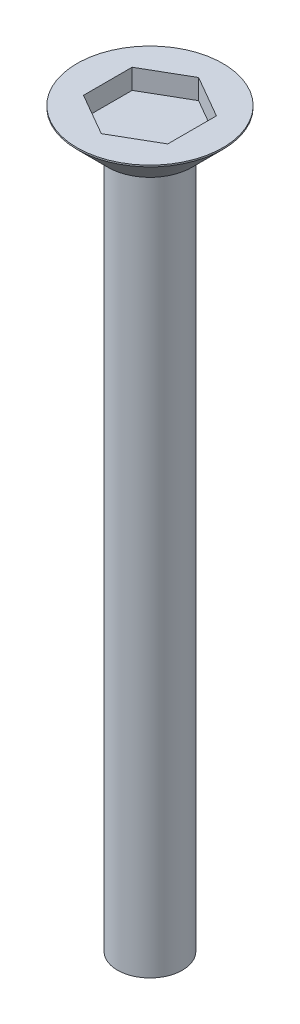
ISO-10303-21;
HEADER;
FILE_DESCRIPTION(('STEP AP214'),'2;1');
FILE_NAME('part.step','',(''),(''),'','','');
FILE_SCHEMA(('AUTOMOTIVE_DESIGN { 1 0 10303 214 1 1 1 1 }'));
ENDSEC;
DATA;
#1=APPLICATION_CONTEXT('core data for automotive mechanical design processes');
#2=APPLICATION_PROTOCOL_DEFINITION('international standard','automotive_design',2000,#1);
#3=PRODUCT_CONTEXT('',#1,'mechanical');
#4=PRODUCT('Part','Part','',(#3));
#5=PRODUCT_RELATED_PRODUCT_CATEGORY('part','',(#4));
#6=PRODUCT_DEFINITION_FORMATION('','',#4);
#7=PRODUCT_DEFINITION_CONTEXT('part definition',#1,'design');
#8=PRODUCT_DEFINITION('design','',#6,#7);
#9=PRODUCT_DEFINITION_SHAPE('','',#8);
#10=(LENGTH_UNIT() NAMED_UNIT(*) SI_UNIT(.MILLI.,.METRE.));
#11=(NAMED_UNIT(*) PLANE_ANGLE_UNIT() SI_UNIT($,.RADIAN.));
#12=(NAMED_UNIT(*) SI_UNIT($,.STERADIAN.) SOLID_ANGLE_UNIT());
#13=UNCERTAINTY_MEASURE_WITH_UNIT(LENGTH_MEASURE(1.E-05),#10,'distance_accuracy_value','');
#14=(GEOMETRIC_REPRESENTATION_CONTEXT(3) GLOBAL_UNCERTAINTY_ASSIGNED_CONTEXT((#13)) GLOBAL_UNIT_ASSIGNED_CONTEXT((#10,
#11,#12)) REPRESENTATION_CONTEXT('',''));
#15=CARTESIAN_POINT('',(0.,0.,0.));
#16=DIRECTION('',(0.,0.,1.));
#17=DIRECTION('',(1.,0.,0.));
#18=AXIS2_PLACEMENT_3D('',#15,#16,#17);
#19=CARTESIAN_POINT('',(0.,43.18,0.));
#20=DIRECTION('',(0.,-1.,0.));
#21=DIRECTION('',(0.,0.,-1.));
#22=AXIS2_PLACEMENT_3D('',#19,#20,#21);
#23=CYLINDRICAL_SURFACE('',#22,2.);
#24=CARTESIAN_POINT('',(0.,43.18,0.));
#25=DIRECTION('',(0.,1.,0.));
#26=DIRECTION('',(0.,0.,1.));
#27=AXIS2_PLACEMENT_3D('',#24,#25,#26);
#28=CIRCLE('',#27,2.);
#29=CARTESIAN_POINT('',(0.,43.18,2.));
#30=VERTEX_POINT('',#29);
#31=EDGE_CURVE('E153',#30,#30,#28,.T.);
#32=ORIENTED_EDGE('',*,*,#31,.F.);
#33=EDGE_LOOP('',(#32));
#34=FACE_BOUND('',#33,.T.);
#35=CARTESIAN_POINT('',(0.,0.,0.));
#36=DIRECTION('',(0.,1.,0.));
#37=DIRECTION('',(0.,0.,1.));
#38=AXIS2_PLACEMENT_3D('',#35,#36,#37);
#39=CIRCLE('',#38,2.);
#40=CARTESIAN_POINT('',(0.,0.,2.));
#41=VERTEX_POINT('',#40);
#42=EDGE_CURVE('E152',#41,#41,#39,.T.);
#43=ORIENTED_EDGE('',*,*,#42,.T.);
#44=EDGE_LOOP('',(#43));
#45=FACE_BOUND('',#44,.T.);
#46=ADVANCED_FACE('F41',(#34,#45),#23,.T.);
#47=CARTESIAN_POINT('',(0.,0.,0.));
#48=DIRECTION('',(0.,1.,0.));
#49=DIRECTION('',(0.,0.,1.));
#50=AXIS2_PLACEMENT_3D('',#47,#48,#49);
#51=PLANE('',#50);
#52=ORIENTED_EDGE('',*,*,#42,.F.);
#53=EDGE_LOOP('',(#52));
#54=FACE_BOUND('',#53,.T.);
#55=ADVANCED_FACE('F173',(#54),#51,.F.);
#56=CARTESIAN_POINT('',(0.,45.18,0.));
#57=DIRECTION('',(0.,-1.,0.));
#58=DIRECTION('',(0.,0.,-1.));
#59=AXIS2_PLACEMENT_3D('',#56,#57,#58);
#60=CYLINDRICAL_SURFACE('',#59,4.5);
#61=CARTESIAN_POINT('',(0.,45.085,0.));
#62=DIRECTION('',(0.,1.,0.));
#63=DIRECTION('',(0.,0.,1.));
#64=AXIS2_PLACEMENT_3D('',#61,#62,#63);
#65=CIRCLE('',#64,4.5);
#66=CARTESIAN_POINT('',(0.,45.085,4.5));
#67=VERTEX_POINT('',#66);
#68=EDGE_CURVE('E50',#67,#67,#65,.T.);
#69=ORIENTED_EDGE('',*,*,#68,.T.);
#70=EDGE_LOOP('',(#69));
#71=FACE_BOUND('',#70,.T.);
#72=CARTESIAN_POINT('',(0.,45.18,0.));
#73=DIRECTION('',(0.,1.,0.));
#74=DIRECTION('',(0.,0.,1.));
#75=AXIS2_PLACEMENT_3D('',#72,#73,#74);
#76=CIRCLE('',#75,4.5);
#77=CARTESIAN_POINT('',(0.,45.18,4.5));
#78=VERTEX_POINT('',#77);
#79=EDGE_CURVE('E144',#78,#78,#76,.T.);
#80=ORIENTED_EDGE('',*,*,#79,.F.);
#81=EDGE_LOOP('',(#80));
#82=FACE_BOUND('',#81,.T.);
#83=ADVANCED_FACE('F160',(#71,#82),#60,.T.);
#84=CARTESIAN_POINT('',(0.,45.18,0.));
#85=DIRECTION('',(0.,1.,0.));
#86=DIRECTION('',(0.,0.,1.));
#87=AXIS2_PLACEMENT_3D('',#84,#85,#86);
#88=PLANE('',#87);
#89=DIRECTION('',(-0.866025403784439,0.,-0.5));
#90=VECTOR('',#89,1.);
#91=CARTESIAN_POINT('',(2.59807621135332,45.18,-1.5));
#92=LINE('',#91,#90);
#93=CARTESIAN_POINT('',(2.59807621135332,45.18,-1.5));
#94=VERTEX_POINT('',#93);
#95=CARTESIAN_POINT('',(0.,45.18,-3.));
#96=VERTEX_POINT('',#95);
#97=EDGE_CURVE('E57',#94,#96,#92,.T.);
#98=ORIENTED_EDGE('',*,*,#97,.F.);
#99=DIRECTION('',(0.,0.,-1.));
#100=VECTOR('',#99,1.);
#101=CARTESIAN_POINT('',(2.59807621135332,45.18,1.5));
#102=LINE('',#101,#100);
#103=CARTESIAN_POINT('',(2.59807621135332,45.18,1.5));
#104=VERTEX_POINT('',#103);
#105=EDGE_CURVE('E140',#104,#94,#102,.T.);
#106=ORIENTED_EDGE('',*,*,#105,.F.);
#107=DIRECTION('',(0.866025403784439,0.,-0.5));
#108=VECTOR('',#107,1.);
#109=CARTESIAN_POINT('',(0.,45.18,3.));
#110=LINE('',#109,#108);
#111=CARTESIAN_POINT('',(0.,45.18,3.));
#112=VERTEX_POINT('',#111);
#113=EDGE_CURVE('E138',#112,#104,#110,.T.);
#114=ORIENTED_EDGE('',*,*,#113,.F.);
#115=DIRECTION('',(0.866025403784439,0.,0.5));
#116=VECTOR('',#115,1.);
#117=CARTESIAN_POINT('',(-2.59807621135332,45.18,1.5));
#118=LINE('',#117,#116);
#119=CARTESIAN_POINT('',(-2.59807621135332,45.18,1.5));
#120=VERTEX_POINT('',#119);
#121=EDGE_CURVE('E105',#120,#112,#118,.T.);
#122=ORIENTED_EDGE('',*,*,#121,.F.);
#123=DIRECTION('',(0.,0.,1.));
#124=VECTOR('',#123,1.);
#125=CARTESIAN_POINT('',(-2.59807621135332,45.18,-1.5));
#126=LINE('',#125,#124);
#127=CARTESIAN_POINT('',(-2.59807621135332,45.18,-1.5));
#128=VERTEX_POINT('',#127);
#129=EDGE_CURVE('E134',#128,#120,#126,.T.);
#130=ORIENTED_EDGE('',*,*,#129,.F.);
#131=DIRECTION('',(-0.866025403784439,0.,0.5));
#132=VECTOR('',#131,1.);
#133=CARTESIAN_POINT('',(0.,45.18,-3.));
#134=LINE('',#133,#132);
#135=EDGE_CURVE('E131',#96,#128,#134,.T.);
#136=ORIENTED_EDGE('',*,*,#135,.F.);
#137=EDGE_LOOP('',(#98,#106,#114,#122,#130,#136));
#138=FACE_BOUND('',#137,.T.);
#139=ORIENTED_EDGE('',*,*,#79,.T.);
#140=EDGE_LOOP('',(#139));
#141=FACE_BOUND('',#140,.T.);
#142=ADVANCED_FACE('F185',(#138,#141),#88,.T.);
#143=CARTESIAN_POINT('',(0.,43.18,0.));
#144=DIRECTION('',(0.,1.,0.));
#145=DIRECTION('',(0.,0.,1.));
#146=AXIS2_PLACEMENT_3D('',#143,#144,#145);
#147=PLANE('',#146);
#148=CARTESIAN_POINT('',(0.,43.18,0.));
#149=DIRECTION('',(0.,1.,0.));
#150=DIRECTION('',(0.,0.,1.));
#151=AXIS2_PLACEMENT_3D('',#148,#149,#150);
#152=CIRCLE('',#151,2.595);
#153=CARTESIAN_POINT('',(0.,43.18,2.595));
#154=VERTEX_POINT('',#153);
#155=EDGE_CURVE('E11',#154,#154,#152,.F.);
#156=ORIENTED_EDGE('',*,*,#155,.T.);
#157=EDGE_LOOP('',(#156));
#158=FACE_BOUND('',#157,.T.);
#159=ORIENTED_EDGE('',*,*,#31,.T.);
#160=EDGE_LOOP('',(#159));
#161=FACE_BOUND('',#160,.T.);
#162=ADVANCED_FACE('F186',(#158,#161),#147,.F.);
#163=CARTESIAN_POINT('',(2.59807621135332,43.942,-1.5));
#164=DIRECTION('',(0.5,0.,-0.866025403784439));
#165=DIRECTION('',(-0.866025403784439,0.,-0.5));
#166=AXIS2_PLACEMENT_3D('',#163,#164,#165);
#167=PLANE('',#166);
#168=ORIENTED_EDGE('',*,*,#97,.T.);
#169=DIRECTION('',(0.,1.,0.));
#170=VECTOR('',#169,1.);
#171=CARTESIAN_POINT('',(0.,43.942,-3.));
#172=LINE('',#171,#170);
#173=CARTESIAN_POINT('',(0.,43.942,-3.));
#174=VERTEX_POINT('',#173);
#175=EDGE_CURVE('E87',#174,#96,#172,.T.);
#176=ORIENTED_EDGE('',*,*,#175,.F.);
#177=DIRECTION('',(-0.866025403784439,0.,-0.5));
#178=VECTOR('',#177,1.);
#179=CARTESIAN_POINT('',(2.59807621135332,43.942,-1.5));
#180=LINE('',#179,#178);
#181=CARTESIAN_POINT('',(2.59807621135332,43.942,-1.5));
#182=VERTEX_POINT('',#181);
#183=EDGE_CURVE('E142',#182,#174,#180,.T.);
#184=ORIENTED_EDGE('',*,*,#183,.F.);
#185=DIRECTION('',(0.,1.,0.));
#186=VECTOR('',#185,1.);
#187=CARTESIAN_POINT('',(2.59807621135332,43.942,-1.5));
#188=LINE('',#187,#186);
#189=EDGE_CURVE('E65',#182,#94,#188,.T.);
#190=ORIENTED_EDGE('',*,*,#189,.T.);
#191=EDGE_LOOP('',(#168,#176,#184,#190));
#192=FACE_BOUND('',#191,.T.);
#193=ADVANCED_FACE('F188',(#192),#167,.F.);
#194=CARTESIAN_POINT('',(2.59807621135332,43.942,1.5));
#195=DIRECTION('',(1.,0.,0.));
#196=DIRECTION('',(0.,0.,-1.));
#197=AXIS2_PLACEMENT_3D('',#194,#195,#196);
#198=PLANE('',#197);
#199=ORIENTED_EDGE('',*,*,#105,.T.);
#200=ORIENTED_EDGE('',*,*,#189,.F.);
#201=DIRECTION('',(0.,0.,-1.));
#202=VECTOR('',#201,1.);
#203=CARTESIAN_POINT('',(2.59807621135332,43.942,1.5));
#204=LINE('',#203,#202);
#205=CARTESIAN_POINT('',(2.59807621135332,43.942,1.5));
#206=VERTEX_POINT('',#205);
#207=EDGE_CURVE('E117',#206,#182,#204,.T.);
#208=ORIENTED_EDGE('',*,*,#207,.F.);
#209=DIRECTION('',(0.,1.,0.));
#210=VECTOR('',#209,1.);
#211=CARTESIAN_POINT('',(2.59807621135332,43.942,1.5));
#212=LINE('',#211,#210);
#213=EDGE_CURVE('E109',#206,#104,#212,.T.);
#214=ORIENTED_EDGE('',*,*,#213,.T.);
#215=EDGE_LOOP('',(#199,#200,#208,#214));
#216=FACE_BOUND('',#215,.T.);
#217=ADVANCED_FACE('F195',(#216),#198,.F.);
#218=CARTESIAN_POINT('',(0.,43.942,3.));
#219=DIRECTION('',(0.5,0.,0.866025403784439));
#220=DIRECTION('',(0.866025403784439,0.,-0.5));
#221=AXIS2_PLACEMENT_3D('',#218,#219,#220);
#222=PLANE('',#221);
#223=ORIENTED_EDGE('',*,*,#113,.T.);
#224=ORIENTED_EDGE('',*,*,#213,.F.);
#225=DIRECTION('',(0.866025403784439,0.,-0.5));
#226=VECTOR('',#225,1.);
#227=CARTESIAN_POINT('',(0.,43.942,3.));
#228=LINE('',#227,#226);
#229=CARTESIAN_POINT('',(0.,43.942,3.));
#230=VERTEX_POINT('',#229);
#231=EDGE_CURVE('E113',#230,#206,#228,.T.);
#232=ORIENTED_EDGE('',*,*,#231,.F.);
#233=DIRECTION('',(0.,1.,0.));
#234=VECTOR('',#233,1.);
#235=CARTESIAN_POINT('',(0.,43.942,3.));
#236=LINE('',#235,#234);
#237=EDGE_CURVE('E98',#230,#112,#236,.T.);
#238=ORIENTED_EDGE('',*,*,#237,.T.);
#239=EDGE_LOOP('',(#223,#224,#232,#238));
#240=FACE_BOUND('',#239,.T.);
#241=ADVANCED_FACE('F114',(#240),#222,.F.);
#242=CARTESIAN_POINT('',(-2.59807621135332,43.942,1.5));
#243=DIRECTION('',(-0.5,0.,0.866025403784439));
#244=DIRECTION('',(0.866025403784439,0.,0.5));
#245=AXIS2_PLACEMENT_3D('',#242,#243,#244);
#246=PLANE('',#245);
#247=ORIENTED_EDGE('',*,*,#121,.T.);
#248=ORIENTED_EDGE('',*,*,#237,.F.);
#249=DIRECTION('',(0.866025403784439,0.,0.5));
#250=VECTOR('',#249,1.);
#251=CARTESIAN_POINT('',(-2.59807621135332,43.942,1.5));
#252=LINE('',#251,#250);
#253=CARTESIAN_POINT('',(-2.59807621135332,43.942,1.5));
#254=VERTEX_POINT('',#253);
#255=EDGE_CURVE('E102',#254,#230,#252,.T.);
#256=ORIENTED_EDGE('',*,*,#255,.F.);
#257=DIRECTION('',(0.,1.,0.));
#258=VECTOR('',#257,1.);
#259=CARTESIAN_POINT('',(-2.59807621135332,43.942,1.5));
#260=LINE('',#259,#258);
#261=EDGE_CURVE('E110',#254,#120,#260,.T.);
#262=ORIENTED_EDGE('',*,*,#261,.T.);
#263=EDGE_LOOP('',(#247,#248,#256,#262));
#264=FACE_BOUND('',#263,.T.);
#265=ADVANCED_FACE('F100',(#264),#246,.F.);
#266=CARTESIAN_POINT('',(-2.59807621135332,43.942,-1.5));
#267=DIRECTION('',(-1.,0.,0.));
#268=DIRECTION('',(0.,0.,1.));
#269=AXIS2_PLACEMENT_3D('',#266,#267,#268);
#270=PLANE('',#269);
#271=ORIENTED_EDGE('',*,*,#129,.T.);
#272=ORIENTED_EDGE('',*,*,#261,.F.);
#273=DIRECTION('',(0.,0.,1.));
#274=VECTOR('',#273,1.);
#275=CARTESIAN_POINT('',(-2.59807621135332,43.942,-1.5));
#276=LINE('',#275,#274);
#277=CARTESIAN_POINT('',(-2.59807621135332,43.942,-1.5));
#278=VERTEX_POINT('',#277);
#279=EDGE_CURVE('E123',#278,#254,#276,.T.);
#280=ORIENTED_EDGE('',*,*,#279,.F.);
#281=DIRECTION('',(0.,1.,0.));
#282=VECTOR('',#281,1.);
#283=CARTESIAN_POINT('',(-2.59807621135332,43.942,-1.5));
#284=LINE('',#283,#282);
#285=EDGE_CURVE('E147',#278,#128,#284,.T.);
#286=ORIENTED_EDGE('',*,*,#285,.T.);
#287=EDGE_LOOP('',(#271,#272,#280,#286));
#288=FACE_BOUND('',#287,.T.);
#289=ADVANCED_FACE('F198',(#288),#270,.F.);
#290=CARTESIAN_POINT('',(0.,43.942,-3.));
#291=DIRECTION('',(-0.5,0.,-0.866025403784439));
#292=DIRECTION('',(-0.866025403784439,0.,0.5));
#293=AXIS2_PLACEMENT_3D('',#290,#291,#292);
#294=PLANE('',#293);
#295=ORIENTED_EDGE('',*,*,#135,.T.);
#296=ORIENTED_EDGE('',*,*,#285,.F.);
#297=DIRECTION('',(-0.866025403784439,0.,0.5));
#298=VECTOR('',#297,1.);
#299=CARTESIAN_POINT('',(0.,43.942,-3.));
#300=LINE('',#299,#298);
#301=EDGE_CURVE('E125',#174,#278,#300,.T.);
#302=ORIENTED_EDGE('',*,*,#301,.F.);
#303=ORIENTED_EDGE('',*,*,#175,.T.);
#304=EDGE_LOOP('',(#295,#296,#302,#303));
#305=FACE_BOUND('',#304,.T.);
#306=ADVANCED_FACE('F169',(#305),#294,.F.);
#307=CARTESIAN_POINT('',(0.,43.942,0.));
#308=DIRECTION('',(0.,1.,0.));
#309=DIRECTION('',(0.,0.,1.));
#310=AXIS2_PLACEMENT_3D('',#307,#308,#309);
#311=PLANE('',#310);
#312=ORIENTED_EDGE('',*,*,#183,.T.);
#313=ORIENTED_EDGE('',*,*,#301,.T.);
#314=ORIENTED_EDGE('',*,*,#279,.T.);
#315=ORIENTED_EDGE('',*,*,#255,.T.);
#316=ORIENTED_EDGE('',*,*,#231,.T.);
#317=ORIENTED_EDGE('',*,*,#207,.T.);
#318=EDGE_LOOP('',(#312,#313,#314,#315,#316,#317));
#319=FACE_BOUND('',#318,.T.);
#320=ADVANCED_FACE('F120',(#319),#311,.T.);
#321=CARTESIAN_POINT('',(0.,45.085,0.));
#322=DIRECTION('',(0.,1.,0.));
#323=DIRECTION('',(0.,0.,1.));
#324=AXIS2_PLACEMENT_3D('',#321,#322,#323);
#325=CONICAL_SURFACE('',#324,4.5,0.78539816339745);
#326=ORIENTED_EDGE('',*,*,#155,.F.);
#327=EDGE_LOOP('',(#326));
#328=FACE_BOUND('',#327,.T.);
#329=ORIENTED_EDGE('',*,*,#68,.F.);
#330=EDGE_LOOP('',(#329));
#331=FACE_BOUND('',#330,.T.);
#332=ADVANCED_FACE('F44',(#328,#331),#325,.T.);
#333=CLOSED_SHELL('',(#46,#55,#83,#142,#162,#193,#217,#241,#265,#289,#306,#320,#332));
#334=MANIFOLD_SOLID_BREP('B2',#333);
#335=ADVANCED_BREP_SHAPE_REPRESENTATION('',(#18,#334),#14);
#336=SHAPE_DEFINITION_REPRESENTATION(#9,#335);
ENDSEC;
END-ISO-10303-21;
